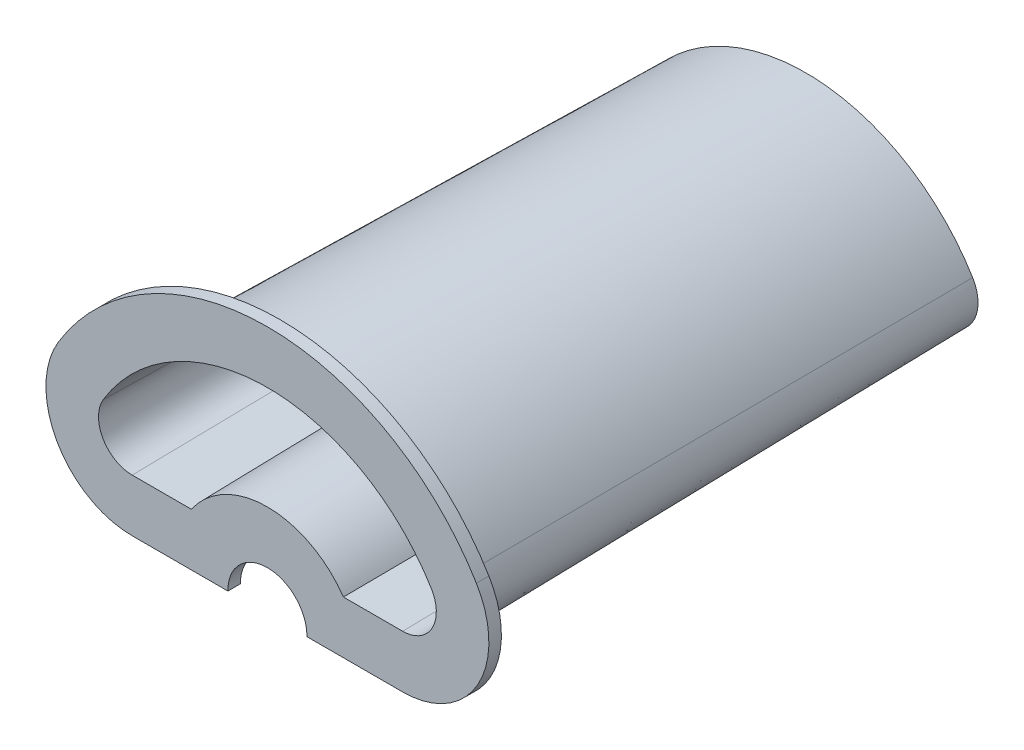
ISO-10303-21;
HEADER;
FILE_DESCRIPTION(('STEP AP214'),'2;1');
FILE_NAME('part.step','',(''),(''),'','','');
FILE_SCHEMA(('AUTOMOTIVE_DESIGN { 1 0 10303 214 1 1 1 1 }'));
ENDSEC;
DATA;
#1=APPLICATION_CONTEXT('core data for automotive mechanical design processes');
#2=APPLICATION_PROTOCOL_DEFINITION('international standard','automotive_design',2000,#1);
#3=PRODUCT_CONTEXT('',#1,'mechanical');
#4=PRODUCT('Part','Part','',(#3));
#5=PRODUCT_RELATED_PRODUCT_CATEGORY('part','',(#4));
#6=PRODUCT_DEFINITION_FORMATION('','',#4);
#7=PRODUCT_DEFINITION_CONTEXT('part definition',#1,'design');
#8=PRODUCT_DEFINITION('design','',#6,#7);
#9=PRODUCT_DEFINITION_SHAPE('','',#8);
#10=(LENGTH_UNIT() NAMED_UNIT(*) SI_UNIT(.MILLI.,.METRE.));
#11=(NAMED_UNIT(*) PLANE_ANGLE_UNIT() SI_UNIT($,.RADIAN.));
#12=(NAMED_UNIT(*) SI_UNIT($,.STERADIAN.) SOLID_ANGLE_UNIT());
#13=UNCERTAINTY_MEASURE_WITH_UNIT(LENGTH_MEASURE(1.E-05),#10,'distance_accuracy_value','');
#14=(GEOMETRIC_REPRESENTATION_CONTEXT(3) GLOBAL_UNCERTAINTY_ASSIGNED_CONTEXT((#13)) GLOBAL_UNIT_ASSIGNED_CONTEXT((#10,
#11,#12)) REPRESENTATION_CONTEXT('',''));
#15=CARTESIAN_POINT('',(0.,0.,0.));
#16=DIRECTION('',(0.,0.,1.));
#17=DIRECTION('',(1.,0.,0.));
#18=AXIS2_PLACEMENT_3D('',#15,#16,#17);
#19=CARTESIAN_POINT('',(0.,2.50379690669413,0.));
#20=DIRECTION('',(0.,0.,-1.));
#21=DIRECTION('',(1.,0.,0.));
#22=AXIS2_PLACEMENT_3D('',#19,#20,#21);
#23=CONICAL_SURFACE('',#22,15.890625,0.0174532925199433);
#24=CARTESIAN_POINT('',(0.,2.50379690669413,0.));
#25=DIRECTION('',(0.,0.,1.));
#26=DIRECTION('',(1.,0.,0.));
#27=AXIS2_PLACEMENT_3D('',#24,#25,#26);
#28=CIRCLE('',#27,15.890625);
#29=CARTESIAN_POINT('',(13.7931142241337,10.3944219066942,0.));
#30=VERTEX_POINT('',#29);
#31=CARTESIAN_POINT('',(-13.7931142241337,10.3944219066942,0.));
#32=VERTEX_POINT('',#31);
#33=EDGE_CURVE('E192',#30,#32,#28,.T.);
#34=ORIENTED_EDGE('',*,*,#33,.T.);
#35=CARTESIAN_POINT('',(-14.8180467363079,12.227203724157,-105.));
#36=CARTESIAN_POINT('',(-14.7633391999748,12.1258714248396,-99.1946764601458));
#37=CARTESIAN_POINT('',(-14.7083288659009,12.0245391753846,-93.3893557769135));
#38=CARTESIAN_POINT('',(-14.5976815182189,11.8218747826987,-81.7787204960187));
#39=CARTESIAN_POINT('',(-14.5420445046232,11.7205426394678,-75.973405898356));
#40=CARTESIAN_POINT('',(-14.3733512571635,11.4150786418874,-58.4733851973958));
#41=CARTESIAN_POINT('',(-14.2593045417743,11.2109469537689,-46.7786886174628));
#42=CARTESIAN_POINT('',(-14.0283816548114,10.8026840569934,-23.3893229259321));
#43=CARTESIAN_POINT('',(-13.9115054831249,10.5985528483364,-11.6946538143355));
#44=CARTESIAN_POINT('',(-13.7931142241338,10.3944219066942,0.));
#45=B_SPLINE_CURVE_WITH_KNOTS('',3,(#35,#36,#37,#38,#39,#40,#41,#42,#43,#44),.UNSPECIFIED.,.F.,
.F.,(4,2,2,2,4),(0.,17.4193967279432,34.8387931112639,69.9298947725837,105.02099783334),.UNSPECIFIED.);
#46=CARTESIAN_POINT('',(-14.8180467363079,12.227203724157,-105.));
#47=VERTEX_POINT('',#46);
#48=EDGE_CURVE('E191',#47,#32,#45,.T.);
#49=ORIENTED_EDGE('',*,*,#48,.F.);
#50=CARTESIAN_POINT('',(0.,2.50379690669413,-105.));
#51=DIRECTION('',(0.,0.,1.));
#52=DIRECTION('',(1.,0.,0.));
#53=AXIS2_PLACEMENT_3D('',#50,#51,#52);
#54=CIRCLE('',#53,17.7234068174629);
#55=CARTESIAN_POINT('',(14.8180467363079,12.227203724157,-105.));
#56=VERTEX_POINT('',#55);
#57=EDGE_CURVE('E179',#56,#47,#54,.T.);
#58=ORIENTED_EDGE('',*,*,#57,.F.);
#59=CARTESIAN_POINT('',(14.8180467363079,12.227203724157,-105.));
#60=CARTESIAN_POINT('',(14.7633391999748,12.1258714248396,-99.1946764601458));
#61=CARTESIAN_POINT('',(14.7083288659009,12.0245391753846,-93.3893557769135));
#62=CARTESIAN_POINT('',(14.5976815182189,11.8218747826987,-81.7787204960187));
#63=CARTESIAN_POINT('',(14.5420445046232,11.7205426394678,-75.973405898356));
#64=CARTESIAN_POINT('',(14.3733512571635,11.4150786418874,-58.4733851973958));
#65=CARTESIAN_POINT('',(14.2593045417743,11.2109469537689,-46.7786886174628));
#66=CARTESIAN_POINT('',(14.0283816548114,10.8026840569934,-23.3893229259321));
#67=CARTESIAN_POINT('',(13.9115054831249,10.5985528483364,-11.6946538143355));
#68=CARTESIAN_POINT('',(13.7931142241338,10.3944219066942,0.));
#69=B_SPLINE_CURVE_WITH_KNOTS('',3,(#59,#60,#61,#62,#63,#64,#65,#66,#67,#68),.UNSPECIFIED.,.F.,
.F.,(4,2,2,2,4),(0.,17.4193967279432,34.8387931112639,69.9298947725837,105.02099783334),.UNSPECIFIED.);
#70=EDGE_CURVE('E212',#56,#30,#69,.T.);
#71=ORIENTED_EDGE('',*,*,#70,.T.);
#72=EDGE_LOOP('',(#34,#49,#58,#71));
#73=FACE_BOUND('',#72,.T.);
#74=ADVANCED_FACE('F37',(#73),#23,.F.);
#75=CARTESIAN_POINT('',(-27.,10.3944219066942,0.));
#76=DIRECTION('',(0.,-0.999847695156391,-0.0174524064372835));
#77=DIRECTION('',(0.,0.0174524064372835,-0.999847695156391));
#78=AXIS2_PLACEMENT_3D('',#75,#76,#77);
#79=PLANE('',#78);
#80=DIRECTION('',(1.,0.,0.));
#81=VECTOR('',#80,1.);
#82=CARTESIAN_POINT('',(-27.,10.3944219066942,0.));
#83=LINE('',#82,#81);
#84=CARTESIAN_POINT('',(-27.,10.3944219066942,0.));
#85=VERTEX_POINT('',#84);
#86=EDGE_CURVE('E336',#85,#32,#83,.T.);
#87=ORIENTED_EDGE('',*,*,#86,.F.);
#88=DIRECTION('',(0.,-0.0174524064372835,0.999847695156391));
#89=VECTOR('',#88,1.);
#90=CARTESIAN_POINT('',(-27.,10.3944219066942,0.));
#91=LINE('',#90,#89);
#92=CARTESIAN_POINT('',(-27.,12.227203724157,-105.));
#93=VERTEX_POINT('',#92);
#94=EDGE_CURVE('E196',#93,#85,#91,.T.);
#95=ORIENTED_EDGE('',*,*,#94,.F.);
#96=DIRECTION('',(1.,0.,0.));
#97=VECTOR('',#96,1.);
#98=CARTESIAN_POINT('',(0.,12.227203724157,-105.));
#99=LINE('',#98,#97);
#100=EDGE_CURVE('E183',#93,#47,#99,.T.);
#101=ORIENTED_EDGE('',*,*,#100,.T.);
#102=ORIENTED_EDGE('',*,*,#48,.T.);
#103=EDGE_LOOP('',(#87,#95,#101,#102));
#104=FACE_BOUND('',#103,.T.);
#105=ADVANCED_FACE('F198',(#104),#79,.T.);
#106=CARTESIAN_POINT('',(-27.,19.6194219066942,0.));
#107=DIRECTION('',(0.,0.,1.));
#108=DIRECTION('',(1.,0.,0.));
#109=AXIS2_PLACEMENT_3D('',#106,#107,#108);
#110=CONICAL_SURFACE('',#109,9.22499999999998,0.0174532925199433);
#111=CARTESIAN_POINT('',(-27.,19.6194219066942,0.));
#112=DIRECTION('',(0.,0.,1.));
#113=DIRECTION('',(1.,0.,0.));
#114=AXIS2_PLACEMENT_3D('',#111,#112,#113);
#115=CIRCLE('',#114,9.22499999999998);
#116=CARTESIAN_POINT('',(-34.8870463730677,24.4043069114856,0.));
#117=VERTEX_POINT('',#116);
#118=EDGE_CURVE('E333',#117,#85,#115,.T.);
#119=ORIENTED_EDGE('',*,*,#118,.F.);
#120=DIRECTION('',(-0.014921185787803,0.00905233147526114,0.999847695156391));
#121=VECTOR('',#120,1.);
#122=CARTESIAN_POINT('',(-34.8870463730677,24.4043069114856,0.));
#123=LINE('',#122,#121);
#124=CARTESIAN_POINT('',(-33.3200832092688,23.4536673195688,-105.));
#125=VERTEX_POINT('',#124);
#126=EDGE_CURVE('E329',#125,#117,#123,.T.);
#127=ORIENTED_EDGE('',*,*,#126,.F.);
#128=CARTESIAN_POINT('',(-27.,19.6194219066942,-105.));
#129=DIRECTION('',(0.,0.,1.));
#130=DIRECTION('',(1.,0.,0.));
#131=AXIS2_PLACEMENT_3D('',#128,#129,#130);
#132=CIRCLE('',#131,7.39221818253713);
#133=EDGE_CURVE('E200',#125,#93,#132,.T.);
#134=ORIENTED_EDGE('',*,*,#133,.T.);
#135=ORIENTED_EDGE('',*,*,#94,.T.);
#136=EDGE_LOOP('',(#119,#127,#134,#135));
#137=FACE_BOUND('',#136,.T.);
#138=ADVANCED_FACE('F39',(#137),#110,.T.);
#139=CARTESIAN_POINT('',(0.,3.23915874879948,0.));
#140=DIRECTION('',(0.,0.,1.));
#141=DIRECTION('',(1.,0.,0.));
#142=AXIS2_PLACEMENT_3D('',#139,#140,#141);
#143=CONICAL_SURFACE('',#142,40.8052631578947,0.0174532925199433);
#144=CARTESIAN_POINT('',(0.,3.23915874879948,0.));
#145=DIRECTION('',(0.,0.,1.));
#146=DIRECTION('',(1.,0.,0.));
#147=AXIS2_PLACEMENT_3D('',#144,#145,#146);
#148=CIRCLE('',#147,40.8052631578947);
#149=CARTESIAN_POINT('',(34.8870463730677,24.4043069114856,0.));
#150=VERTEX_POINT('',#149);
#151=EDGE_CURVE('E325',#150,#117,#148,.T.);
#152=ORIENTED_EDGE('',*,*,#151,.F.);
#153=DIRECTION('',(0.0149211857878029,0.00905233147526117,0.999847695156391));
#154=VECTOR('',#153,1.);
#155=CARTESIAN_POINT('',(34.8870463730677,24.4043069114856,0.));
#156=LINE('',#155,#154);
#157=CARTESIAN_POINT('',(33.3200832092688,23.4536673195688,-105.));
#158=VERTEX_POINT('',#157);
#159=EDGE_CURVE('E327',#158,#150,#156,.T.);
#160=ORIENTED_EDGE('',*,*,#159,.F.);
#161=CARTESIAN_POINT('',(0.,3.23915874879948,-105.));
#162=DIRECTION('',(0.,0.,1.));
#163=DIRECTION('',(1.,0.,0.));
#164=AXIS2_PLACEMENT_3D('',#161,#162,#163);
#165=CIRCLE('',#164,38.9724813404318);
#166=EDGE_CURVE('E202',#158,#125,#165,.T.);
#167=ORIENTED_EDGE('',*,*,#166,.T.);
#168=ORIENTED_EDGE('',*,*,#126,.T.);
#169=EDGE_LOOP('',(#152,#160,#167,#168));
#170=FACE_BOUND('',#169,.T.);
#171=ADVANCED_FACE('F315',(#170),#143,.T.);
#172=CARTESIAN_POINT('',(27.,19.6194219066942,0.));
#173=DIRECTION('',(0.,0.,1.));
#174=DIRECTION('',(1.,0.,0.));
#175=AXIS2_PLACEMENT_3D('',#172,#173,#174);
#176=CONICAL_SURFACE('',#175,9.22499999999993,0.0174532925199433);
#177=CARTESIAN_POINT('',(27.,19.6194219066942,0.));
#178=DIRECTION('',(0.,0.,1.));
#179=DIRECTION('',(1.,0.,0.));
#180=AXIS2_PLACEMENT_3D('',#177,#178,#179);
#181=CIRCLE('',#180,9.22499999999993);
#182=CARTESIAN_POINT('',(27.,10.3944219066942,0.));
#183=VERTEX_POINT('',#182);
#184=EDGE_CURVE('E332',#183,#150,#181,.T.);
#185=ORIENTED_EDGE('',*,*,#184,.F.);
#186=DIRECTION('',(0.,-0.0174524064372835,0.999847695156391));
#187=VECTOR('',#186,1.);
#188=CARTESIAN_POINT('',(27.,10.3944219066942,0.));
#189=LINE('',#188,#187);
#190=CARTESIAN_POINT('',(27.,12.2272037241571,-105.));
#191=VERTEX_POINT('',#190);
#192=EDGE_CURVE('E307',#191,#183,#189,.T.);
#193=ORIENTED_EDGE('',*,*,#192,.F.);
#194=CARTESIAN_POINT('',(27.,19.6194219066942,-105.));
#195=DIRECTION('',(0.,0.,1.));
#196=DIRECTION('',(1.,0.,0.));
#197=AXIS2_PLACEMENT_3D('',#194,#195,#196);
#198=CIRCLE('',#197,7.39221818253708);
#199=EDGE_CURVE('E208',#191,#158,#198,.T.);
#200=ORIENTED_EDGE('',*,*,#199,.T.);
#201=ORIENTED_EDGE('',*,*,#159,.T.);
#202=EDGE_LOOP('',(#185,#193,#200,#201));
#203=FACE_BOUND('',#202,.T.);
#204=ADVANCED_FACE('F312',(#203),#176,.T.);
#205=CARTESIAN_POINT('',(27.,10.3944219066942,0.));
#206=DIRECTION('',(0.,-0.999847695156391,-0.0174524064372835));
#207=DIRECTION('',(0.,0.0174524064372835,-0.999847695156391));
#208=AXIS2_PLACEMENT_3D('',#205,#206,#207);
#209=PLANE('',#208);
#210=DIRECTION('',(-1.,0.,0.));
#211=VECTOR('',#210,1.);
#212=CARTESIAN_POINT('',(27.,10.3944219066942,0.));
#213=LINE('',#212,#211);
#214=EDGE_CURVE('E187',#183,#30,#213,.T.);
#215=ORIENTED_EDGE('',*,*,#214,.T.);
#216=ORIENTED_EDGE('',*,*,#70,.F.);
#217=DIRECTION('',(1.,0.,0.));
#218=VECTOR('',#217,1.);
#219=CARTESIAN_POINT('',(0.,12.227203724157,-105.));
#220=LINE('',#219,#218);
#221=EDGE_CURVE('E60',#191,#56,#220,.F.);
#222=ORIENTED_EDGE('',*,*,#221,.F.);
#223=ORIENTED_EDGE('',*,*,#192,.T.);
#224=EDGE_LOOP('',(#215,#216,#222,#223));
#225=FACE_BOUND('',#224,.T.);
#226=ADVANCED_FACE('F175',(#225),#209,.T.);
#227=CARTESIAN_POINT('',(0.,2.50379690669413,-105.));
#228=DIRECTION('',(0.,0.,1.));
#229=DIRECTION('',(1.,0.,0.));
#230=AXIS2_PLACEMENT_3D('',#227,#228,#229);
#231=PLANE('',#230);
#232=CARTESIAN_POINT('',(29.7171397821141,16.8730289458034,-105.));
#233=DIRECTION('',(0.,0.,1.));
#234=DIRECTION('',(1.,0.,0.));
#235=AXIS2_PLACEMENT_3D('',#232,#233,#234);
#236=CIRCLE('',#235,1.4);
#237=CARTESIAN_POINT('',(31.1171397821141,16.8730289458034,-105.));
#238=VERTEX_POINT('',#237);
#239=EDGE_CURVE('E12',#238,#238,#236,.F.);
#240=ORIENTED_EDGE('',*,*,#239,.F.);
#241=EDGE_LOOP('',(#240));
#242=FACE_BOUND('',#241,.T.);
#243=ORIENTED_EDGE('',*,*,#57,.T.);
#244=ORIENTED_EDGE('',*,*,#100,.F.);
#245=ORIENTED_EDGE('',*,*,#133,.F.);
#246=ORIENTED_EDGE('',*,*,#166,.F.);
#247=ORIENTED_EDGE('',*,*,#199,.F.);
#248=ORIENTED_EDGE('',*,*,#221,.T.);
#249=EDGE_LOOP('',(#243,#244,#245,#246,#247,#248));
#250=FACE_BOUND('',#249,.T.);
#251=ADVANCED_FACE('F172',(#242,#250),#231,.F.);
#252=CARTESIAN_POINT('',(0.,2.50379690669413,0.));
#253=DIRECTION('',(0.,0.,1.));
#254=DIRECTION('',(1.,0.,0.));
#255=AXIS2_PLACEMENT_3D('',#252,#253,#254);
#256=PLANE('',#255);
#257=CARTESIAN_POINT('',(0.,2.50379690669413,0.));
#258=DIRECTION('',(0.,0.,1.));
#259=DIRECTION('',(1.,0.,0.));
#260=AXIS2_PLACEMENT_3D('',#257,#258,#259);
#261=CIRCLE('',#260,7.89062500000001);
#262=CARTESIAN_POINT('',(7.88986691902976,2.39442190669415,0.));
#263=VERTEX_POINT('',#262);
#264=CARTESIAN_POINT('',(-7.88986691902976,2.39442190669416,0.));
#265=VERTEX_POINT('',#264);
#266=EDGE_CURVE('E373',#263,#265,#261,.T.);
#267=ORIENTED_EDGE('',*,*,#266,.T.);
#268=DIRECTION('',(1.,0.,0.));
#269=VECTOR('',#268,1.);
#270=CARTESIAN_POINT('',(-27.,2.39442190669419,0.));
#271=LINE('',#270,#269);
#272=CARTESIAN_POINT('',(-27.,2.3944219066942,0.));
#273=VERTEX_POINT('',#272);
#274=EDGE_CURVE('E370',#273,#265,#271,.T.);
#275=ORIENTED_EDGE('',*,*,#274,.F.);
#276=CARTESIAN_POINT('',(-27.,19.6194219066942,0.));
#277=DIRECTION('',(0.,0.,1.));
#278=DIRECTION('',(1.,0.,0.));
#279=AXIS2_PLACEMENT_3D('',#276,#277,#278);
#280=CIRCLE('',#279,17.225);
#281=CARTESIAN_POINT('',(-41.7267613849422,28.5538006825785,0.));
#282=VERTEX_POINT('',#281);
#283=EDGE_CURVE('E368',#282,#273,#280,.T.);
#284=ORIENTED_EDGE('',*,*,#283,.F.);
#285=CARTESIAN_POINT('',(0.,3.23915874879948,0.));
#286=DIRECTION('',(0.,0.,1.));
#287=DIRECTION('',(1.,0.,0.));
#288=AXIS2_PLACEMENT_3D('',#285,#286,#287);
#289=CIRCLE('',#288,48.8052631578947);
#290=CARTESIAN_POINT('',(41.7267613849422,28.5538006825785,0.));
#291=VERTEX_POINT('',#290);
#292=EDGE_CURVE('E366',#291,#282,#289,.T.);
#293=ORIENTED_EDGE('',*,*,#292,.F.);
#294=CARTESIAN_POINT('',(27.,19.6194219066942,0.));
#295=DIRECTION('',(0.,0.,1.));
#296=DIRECTION('',(1.,0.,0.));
#297=AXIS2_PLACEMENT_3D('',#294,#295,#296);
#298=CIRCLE('',#297,17.2249999999999);
#299=CARTESIAN_POINT('',(27.,2.39442190669421,0.));
#300=VERTEX_POINT('',#299);
#301=EDGE_CURVE('E364',#300,#291,#298,.T.);
#302=ORIENTED_EDGE('',*,*,#301,.F.);
#303=DIRECTION('',(1.,0.,0.));
#304=VECTOR('',#303,1.);
#305=CARTESIAN_POINT('',(7.88986691902976,2.39442190669415,0.));
#306=LINE('',#305,#304);
#307=EDGE_CURVE('E361',#263,#300,#306,.T.);
#308=ORIENTED_EDGE('',*,*,#307,.F.);
#309=EDGE_LOOP('',(#267,#275,#284,#293,#302,#308));
#310=FACE_BOUND('',#309,.T.);
#311=ORIENTED_EDGE('',*,*,#86,.T.);
#312=ORIENTED_EDGE('',*,*,#33,.F.);
#313=ORIENTED_EDGE('',*,*,#214,.F.);
#314=ORIENTED_EDGE('',*,*,#184,.T.);
#315=ORIENTED_EDGE('',*,*,#151,.T.);
#316=ORIENTED_EDGE('',*,*,#118,.T.);
#317=EDGE_LOOP('',(#311,#312,#313,#314,#315,#316));
#318=FACE_BOUND('',#317,.T.);
#319=ADVANCED_FACE('F174',(#310,#318),#256,.F.);
#320=CARTESIAN_POINT('',(0.,2.50379690669413,2.5));
#321=DIRECTION('',(0.,0.,-1.));
#322=DIRECTION('',(-1.,0.,0.));
#323=AXIS2_PLACEMENT_3D('',#320,#321,#322);
#324=CYLINDRICAL_SURFACE('',#323,7.89062500000001);
#325=ORIENTED_EDGE('',*,*,#266,.F.);
#326=DIRECTION('',(0.,0.,-1.));
#327=VECTOR('',#326,1.);
#328=CARTESIAN_POINT('',(7.88986691902976,2.39442190669415,2.5));
#329=LINE('',#328,#327);
#330=CARTESIAN_POINT('',(7.88986691902976,2.39442190669415,2.5));
#331=VERTEX_POINT('',#330);
#332=EDGE_CURVE('E342',#331,#263,#329,.T.);
#333=ORIENTED_EDGE('',*,*,#332,.F.);
#334=CARTESIAN_POINT('',(0.,2.50379690669413,2.5));
#335=DIRECTION('',(0.,0.,1.));
#336=DIRECTION('',(1.,0.,0.));
#337=AXIS2_PLACEMENT_3D('',#334,#335,#336);
#338=CIRCLE('',#337,7.89062500000001);
#339=CARTESIAN_POINT('',(-7.88986691902976,2.39442190669416,2.5));
#340=VERTEX_POINT('',#339);
#341=EDGE_CURVE('E363',#331,#340,#338,.T.);
#342=ORIENTED_EDGE('',*,*,#341,.T.);
#343=DIRECTION('',(0.,0.,-1.));
#344=VECTOR('',#343,1.);
#345=CARTESIAN_POINT('',(-7.88986691902976,2.39442190669416,2.5));
#346=LINE('',#345,#344);
#347=EDGE_CURVE('E347',#340,#265,#346,.T.);
#348=ORIENTED_EDGE('',*,*,#347,.T.);
#349=EDGE_LOOP('',(#325,#333,#342,#348));
#350=FACE_BOUND('',#349,.T.);
#351=ADVANCED_FACE('F423',(#350),#324,.F.);
#352=CARTESIAN_POINT('',(7.88986691902976,2.39442190669415,2.5));
#353=DIRECTION('',(0.,1.,0.));
#354=DIRECTION('',(-1.,0.,0.));
#355=AXIS2_PLACEMENT_3D('',#352,#353,#354);
#356=PLANE('',#355);
#357=ORIENTED_EDGE('',*,*,#307,.T.);
#358=DIRECTION('',(0.,0.,-1.));
#359=VECTOR('',#358,1.);
#360=CARTESIAN_POINT('',(27.,2.39442190669421,2.5));
#361=LINE('',#360,#359);
#362=CARTESIAN_POINT('',(27.,2.39442190669421,2.5));
#363=VERTEX_POINT('',#362);
#364=EDGE_CURVE('E344',#363,#300,#361,.T.);
#365=ORIENTED_EDGE('',*,*,#364,.F.);
#366=DIRECTION('',(1.,0.,0.));
#367=VECTOR('',#366,1.);
#368=CARTESIAN_POINT('',(7.88986691902976,2.39442190669415,2.5));
#369=LINE('',#368,#367);
#370=EDGE_CURVE('E350',#331,#363,#369,.T.);
#371=ORIENTED_EDGE('',*,*,#370,.F.);
#372=ORIENTED_EDGE('',*,*,#332,.T.);
#373=EDGE_LOOP('',(#357,#365,#371,#372));
#374=FACE_BOUND('',#373,.T.);
#375=ADVANCED_FACE('F425',(#374),#356,.F.);
#376=CARTESIAN_POINT('',(27.,19.6194219066942,2.5));
#377=DIRECTION('',(0.,0.,-1.));
#378=DIRECTION('',(-1.,0.,0.));
#379=AXIS2_PLACEMENT_3D('',#376,#377,#378);
#380=CYLINDRICAL_SURFACE('',#379,17.2249999999999);
#381=ORIENTED_EDGE('',*,*,#301,.T.);
#382=DIRECTION('',(0.,0.,-1.));
#383=VECTOR('',#382,1.);
#384=CARTESIAN_POINT('',(41.7267613849422,28.5538006825785,2.5));
#385=LINE('',#384,#383);
#386=CARTESIAN_POINT('',(41.7267613849422,28.5538006825785,2.5));
#387=VERTEX_POINT('',#386);
#388=EDGE_CURVE('E356',#387,#291,#385,.T.);
#389=ORIENTED_EDGE('',*,*,#388,.F.);
#390=CARTESIAN_POINT('',(27.,19.6194219066942,2.5));
#391=DIRECTION('',(0.,0.,1.));
#392=DIRECTION('',(1.,0.,0.));
#393=AXIS2_PLACEMENT_3D('',#390,#391,#392);
#394=CIRCLE('',#393,17.2249999999999);
#395=EDGE_CURVE('E378',#363,#387,#394,.T.);
#396=ORIENTED_EDGE('',*,*,#395,.F.);
#397=ORIENTED_EDGE('',*,*,#364,.T.);
#398=EDGE_LOOP('',(#381,#389,#396,#397));
#399=FACE_BOUND('',#398,.T.);
#400=ADVANCED_FACE('F428',(#399),#380,.T.);
#401=CARTESIAN_POINT('',(0.,3.23915874879948,2.5));
#402=DIRECTION('',(0.,0.,-1.));
#403=DIRECTION('',(-1.,0.,0.));
#404=AXIS2_PLACEMENT_3D('',#401,#402,#403);
#405=CYLINDRICAL_SURFACE('',#404,48.8052631578947);
#406=ORIENTED_EDGE('',*,*,#292,.T.);
#407=DIRECTION('',(0.,0.,-1.));
#408=VECTOR('',#407,1.);
#409=CARTESIAN_POINT('',(-41.7267613849422,28.5538006825785,2.5));
#410=LINE('',#409,#408);
#411=CARTESIAN_POINT('',(-41.7267613849422,28.5538006825785,2.5));
#412=VERTEX_POINT('',#411);
#413=EDGE_CURVE('E353',#412,#282,#410,.T.);
#414=ORIENTED_EDGE('',*,*,#413,.F.);
#415=CARTESIAN_POINT('',(0.,3.23915874879948,2.5));
#416=DIRECTION('',(0.,0.,1.));
#417=DIRECTION('',(1.,0.,0.));
#418=AXIS2_PLACEMENT_3D('',#415,#416,#417);
#419=CIRCLE('',#418,48.8052631578947);
#420=EDGE_CURVE('E380',#387,#412,#419,.T.);
#421=ORIENTED_EDGE('',*,*,#420,.F.);
#422=ORIENTED_EDGE('',*,*,#388,.T.);
#423=EDGE_LOOP('',(#406,#414,#421,#422));
#424=FACE_BOUND('',#423,.T.);
#425=ADVANCED_FACE('F432',(#424),#405,.T.);
#426=CARTESIAN_POINT('',(-27.,19.6194219066942,2.5));
#427=DIRECTION('',(0.,0.,-1.));
#428=DIRECTION('',(-1.,0.,0.));
#429=AXIS2_PLACEMENT_3D('',#426,#427,#428);
#430=CYLINDRICAL_SURFACE('',#429,17.225);
#431=ORIENTED_EDGE('',*,*,#283,.T.);
#432=DIRECTION('',(0.,0.,-1.));
#433=VECTOR('',#432,1.);
#434=CARTESIAN_POINT('',(-27.,2.3944219066942,2.5));
#435=LINE('',#434,#433);
#436=CARTESIAN_POINT('',(-27.,2.3944219066942,2.5));
#437=VERTEX_POINT('',#436);
#438=EDGE_CURVE('E349',#437,#273,#435,.T.);
#439=ORIENTED_EDGE('',*,*,#438,.F.);
#440=CARTESIAN_POINT('',(-27.,19.6194219066942,2.5));
#441=DIRECTION('',(0.,0.,1.));
#442=DIRECTION('',(1.,0.,0.));
#443=AXIS2_PLACEMENT_3D('',#440,#441,#442);
#444=CIRCLE('',#443,17.225);
#445=EDGE_CURVE('E382',#412,#437,#444,.T.);
#446=ORIENTED_EDGE('',*,*,#445,.F.);
#447=ORIENTED_EDGE('',*,*,#413,.T.);
#448=EDGE_LOOP('',(#431,#439,#446,#447));
#449=FACE_BOUND('',#448,.T.);
#450=ADVANCED_FACE('F436',(#449),#430,.T.);
#451=CARTESIAN_POINT('',(-27.,2.39442190669419,2.5));
#452=DIRECTION('',(0.,1.,0.));
#453=DIRECTION('',(-1.,0.,0.));
#454=AXIS2_PLACEMENT_3D('',#451,#452,#453);
#455=PLANE('',#454);
#456=ORIENTED_EDGE('',*,*,#274,.T.);
#457=ORIENTED_EDGE('',*,*,#347,.F.);
#458=DIRECTION('',(1.,0.,0.));
#459=VECTOR('',#458,1.);
#460=CARTESIAN_POINT('',(-27.,2.39442190669419,2.5));
#461=LINE('',#460,#459);
#462=EDGE_CURVE('E384',#437,#340,#461,.T.);
#463=ORIENTED_EDGE('',*,*,#462,.F.);
#464=ORIENTED_EDGE('',*,*,#438,.T.);
#465=EDGE_LOOP('',(#456,#457,#463,#464));
#466=FACE_BOUND('',#465,.T.);
#467=ADVANCED_FACE('F420',(#466),#455,.F.);
#468=CARTESIAN_POINT('',(0.,2.50379690669413,2.5));
#469=DIRECTION('',(0.,0.,1.));
#470=DIRECTION('',(1.,0.,0.));
#471=AXIS2_PLACEMENT_3D('',#468,#469,#470);
#472=PLANE('',#471);
#473=CARTESIAN_POINT('',(0.,2.50379690669413,2.5));
#474=DIRECTION('',(0.,0.,1.));
#475=DIRECTION('',(1.,0.,0.));
#476=AXIS2_PLACEMENT_3D('',#473,#474,#475);
#477=CIRCLE('',#476,18.390625);
#478=CARTESIAN_POINT('',(-15.1739909054935,12.8944219066942,2.5));
#479=VERTEX_POINT('',#478);
#480=CARTESIAN_POINT('',(15.1739909054935,12.8944219066942,2.5));
#481=VERTEX_POINT('',#480);
#482=EDGE_CURVE('E45',#479,#481,#477,.F.);
#483=ORIENTED_EDGE('',*,*,#482,.F.);
#484=DIRECTION('',(-1.,0.,0.));
#485=VECTOR('',#484,1.);
#486=CARTESIAN_POINT('',(0.,12.8944219066941,2.5));
#487=LINE('',#486,#485);
#488=CARTESIAN_POINT('',(-27.,12.8944219066942,2.5));
#489=VERTEX_POINT('',#488);
#490=EDGE_CURVE('E226',#479,#489,#487,.T.);
#491=ORIENTED_EDGE('',*,*,#490,.T.);
#492=CARTESIAN_POINT('',(-27.,19.6194219066942,2.5));
#493=DIRECTION('',(0.,0.,1.));
#494=DIRECTION('',(1.,0.,0.));
#495=AXIS2_PLACEMENT_3D('',#492,#493,#494);
#496=CIRCLE('',#495,6.72499999999996);
#497=CARTESIAN_POINT('',(-32.749635431857,23.1075901080191,2.5));
#498=VERTEX_POINT('',#497);
#499=EDGE_CURVE('E52',#489,#498,#496,.F.);
#500=ORIENTED_EDGE('',*,*,#499,.T.);
#501=CARTESIAN_POINT('',(0.,3.23915874879948,2.5));
#502=DIRECTION('',(0.,0.,1.));
#503=DIRECTION('',(1.,0.,0.));
#504=AXIS2_PLACEMENT_3D('',#501,#502,#503);
#505=CIRCLE('',#504,38.3052631578947);
#506=CARTESIAN_POINT('',(32.749635431857,23.1075901080191,2.5));
#507=VERTEX_POINT('',#506);
#508=EDGE_CURVE('E220',#498,#507,#505,.F.);
#509=ORIENTED_EDGE('',*,*,#508,.T.);
#510=CARTESIAN_POINT('',(27.,19.6194219066942,2.5));
#511=DIRECTION('',(0.,0.,1.));
#512=DIRECTION('',(1.,0.,0.));
#513=AXIS2_PLACEMENT_3D('',#510,#511,#512);
#514=CIRCLE('',#513,6.72499999999993);
#515=CARTESIAN_POINT('',(27.,12.8944219066942,2.5));
#516=VERTEX_POINT('',#515);
#517=EDGE_CURVE('E216',#507,#516,#514,.F.);
#518=ORIENTED_EDGE('',*,*,#517,.T.);
#519=DIRECTION('',(-1.,0.,0.));
#520=VECTOR('',#519,1.);
#521=CARTESIAN_POINT('',(0.,12.8944219066941,2.5));
#522=LINE('',#521,#520);
#523=EDGE_CURVE('E195',#516,#481,#522,.T.);
#524=ORIENTED_EDGE('',*,*,#523,.T.);
#525=EDGE_LOOP('',(#483,#491,#500,#509,#518,#524));
#526=FACE_BOUND('',#525,.T.);
#527=ORIENTED_EDGE('',*,*,#341,.F.);
#528=ORIENTED_EDGE('',*,*,#370,.T.);
#529=ORIENTED_EDGE('',*,*,#395,.T.);
#530=ORIENTED_EDGE('',*,*,#420,.T.);
#531=ORIENTED_EDGE('',*,*,#445,.T.);
#532=ORIENTED_EDGE('',*,*,#462,.T.);
#533=EDGE_LOOP('',(#527,#528,#529,#530,#531,#532));
#534=FACE_BOUND('',#533,.T.);
#535=ADVANCED_FACE('F243',(#526,#534),#472,.T.);
#536=CARTESIAN_POINT('',(-27.,19.6194219066942,2.5));
#537=DIRECTION('',(0.,0.,1.));
#538=DIRECTION('',(1.,0.,0.));
#539=AXIS2_PLACEMENT_3D('',#536,#537,#538);
#540=CONICAL_SURFACE('',#539,6.72499999999996,0.0174532925199433);
#541=CARTESIAN_POINT('',(-27.,19.6194219066942,-102.5));
#542=DIRECTION('',(0.,0.,1.));
#543=DIRECTION('',(1.,0.,0.));
#544=AXIS2_PLACEMENT_3D('',#541,#542,#543);
#545=CIRCLE('',#544,4.89221818253711);
#546=CARTESIAN_POINT('',(-27.,14.7272037241571,-102.5));
#547=VERTEX_POINT('',#546);
#548=CARTESIAN_POINT('',(-31.182672268058,22.1569505161023,-102.5));
#549=VERTEX_POINT('',#548);
#550=EDGE_CURVE('E388',#547,#549,#545,.F.);
#551=ORIENTED_EDGE('',*,*,#550,.T.);
#552=DIRECTION('',(-0.014921185787803,0.00905233147526113,0.999847695156391));
#553=VECTOR('',#552,1.);
#554=CARTESIAN_POINT('',(-32.749635431857,23.1075901080191,2.5));
#555=LINE('',#554,#553);
#556=EDGE_CURVE('E389',#549,#498,#555,.T.);
#557=ORIENTED_EDGE('',*,*,#556,.T.);
#558=ORIENTED_EDGE('',*,*,#499,.F.);
#559=DIRECTION('',(0.,-0.0174524064372836,0.999847695156391));
#560=VECTOR('',#559,1.);
#561=CARTESIAN_POINT('',(-27.,12.8944219066942,2.5));
#562=LINE('',#561,#560);
#563=EDGE_CURVE('E256',#547,#489,#562,.T.);
#564=ORIENTED_EDGE('',*,*,#563,.F.);
#565=EDGE_LOOP('',(#551,#557,#558,#564));
#566=FACE_BOUND('',#565,.T.);
#567=ADVANCED_FACE('F415',(#566),#540,.F.);
#568=CARTESIAN_POINT('',(0.,3.23915874879948,2.5));
#569=DIRECTION('',(0.,0.,1.));
#570=DIRECTION('',(1.,0.,0.));
#571=AXIS2_PLACEMENT_3D('',#568,#569,#570);
#572=CONICAL_SURFACE('',#571,38.3052631578947,0.0174532925199433);
#573=CARTESIAN_POINT('',(0.,3.23915874879948,-102.5));
#574=DIRECTION('',(0.,0.,1.));
#575=DIRECTION('',(1.,0.,0.));
#576=AXIS2_PLACEMENT_3D('',#573,#574,#575);
#577=CIRCLE('',#576,36.4724813404318);
#578=CARTESIAN_POINT('',(31.1826722680581,22.1569505161023,-102.5));
#579=VERTEX_POINT('',#578);
#580=EDGE_CURVE('E403',#549,#579,#577,.F.);
#581=ORIENTED_EDGE('',*,*,#580,.T.);
#582=DIRECTION('',(0.0149211857878029,0.00905233147526117,0.999847695156391));
#583=VECTOR('',#582,1.);
#584=CARTESIAN_POINT('',(32.749635431857,23.1075901080191,2.5));
#585=LINE('',#584,#583);
#586=EDGE_CURVE('E254',#579,#507,#585,.T.);
#587=ORIENTED_EDGE('',*,*,#586,.T.);
#588=ORIENTED_EDGE('',*,*,#508,.F.);
#589=ORIENTED_EDGE('',*,*,#556,.F.);
#590=EDGE_LOOP('',(#581,#587,#588,#589));
#591=FACE_BOUND('',#590,.T.);
#592=ADVANCED_FACE('F401',(#591),#572,.F.);
#593=CARTESIAN_POINT('',(27.,19.6194219066942,2.5));
#594=DIRECTION('',(0.,0.,1.));
#595=DIRECTION('',(1.,0.,0.));
#596=AXIS2_PLACEMENT_3D('',#593,#594,#595);
#597=CONICAL_SURFACE('',#596,6.72499999999993,0.0174532925199433);
#598=CARTESIAN_POINT('',(27.,19.6194219066942,-102.5));
#599=DIRECTION('',(0.,0.,1.));
#600=DIRECTION('',(1.,0.,0.));
#601=AXIS2_PLACEMENT_3D('',#598,#599,#600);
#602=CIRCLE('',#601,4.89221818253708);
#603=CARTESIAN_POINT('',(27.,14.7272037241571,-102.5));
#604=VERTEX_POINT('',#603);
#605=EDGE_CURVE('E405',#579,#604,#602,.F.);
#606=ORIENTED_EDGE('',*,*,#605,.T.);
#607=DIRECTION('',(0.,-0.0174524064372835,0.999847695156391));
#608=VECTOR('',#607,1.);
#609=CARTESIAN_POINT('',(27.,12.8944219066942,2.5));
#610=LINE('',#609,#608);
#611=EDGE_CURVE('E249',#604,#516,#610,.T.);
#612=ORIENTED_EDGE('',*,*,#611,.T.);
#613=ORIENTED_EDGE('',*,*,#517,.F.);
#614=ORIENTED_EDGE('',*,*,#586,.F.);
#615=EDGE_LOOP('',(#606,#612,#613,#614));
#616=FACE_BOUND('',#615,.T.);
#617=ADVANCED_FACE('F408',(#616),#597,.F.);
#618=CARTESIAN_POINT('',(15.1739909054935,12.8944219066942,2.5));
#619=DIRECTION('',(0.,-0.999847695156391,-0.0174524064372835));
#620=DIRECTION('',(0.,0.0174524064372835,-0.999847695156391));
#621=AXIS2_PLACEMENT_3D('',#618,#619,#620);
#622=PLANE('',#621);
#623=DIRECTION('',(-1.,0.,0.));
#624=VECTOR('',#623,1.);
#625=CARTESIAN_POINT('',(15.1739909054935,14.727203724157,-102.5));
#626=LINE('',#625,#624);
#627=CARTESIAN_POINT('',(16.1113161808527,14.727203724157,-102.5));
#628=VERTEX_POINT('',#627);
#629=EDGE_CURVE('E251',#604,#628,#626,.T.);
#630=ORIENTED_EDGE('',*,*,#629,.T.);
#631=CARTESIAN_POINT('',(16.7552715518239,16.0499922051542,-178.282501321939));
#632=CARTESIAN_POINT('',(16.6964534494491,15.9268021973792,-171.224950503217));
#633=CARTESIAN_POINT('',(16.6373251322298,15.8036122349349,-164.167402281487));
#634=CARTESIAN_POINT('',(16.5184289160983,15.5572324066279,-150.052311371184));
#635=CARTESIAN_POINT('',(16.4586610171995,15.4340425407651,-142.99476868261));
#636=CARTESIAN_POINT('',(16.2020901225526,14.9081131067421,-112.864291586942));
#637=CARTESIAN_POINT('',(16.0020961875213,14.5053740102316,-89.791384200652));
#638=CARTESIAN_POINT('',(15.5941958520911,13.6998970110476,-43.6456378229403));
#639=CARTESIAN_POINT('',(15.386289451152,13.2971591083741,-20.5727988315231));
#640=CARTESIAN_POINT('',(15.1739909054935,12.8944219066942,2.49999999999997));
#641=B_SPLINE_CURVE_WITH_KNOTS('',3,(#631,#632,#633,#634,#635,#636,#637,#638,#639,#640),
.UNSPECIFIED.,.F.,.F.,(4,2,2,2,4),(0.,21.1766127784976,42.3532251156595,111.585089680584,
180.816958971138),.UNSPECIFIED.);
#642=EDGE_CURVE('E237',#628,#481,#641,.T.);
#643=ORIENTED_EDGE('',*,*,#642,.T.);
#644=ORIENTED_EDGE('',*,*,#523,.F.);
#645=ORIENTED_EDGE('',*,*,#611,.F.);
#646=EDGE_LOOP('',(#630,#643,#644,#645));
#647=FACE_BOUND('',#646,.T.);
#648=ADVANCED_FACE('F248',(#647),#622,.F.);
#649=CARTESIAN_POINT('',(0.,2.50379690669413,2.5));
#650=DIRECTION('',(0.,0.,-1.));
#651=DIRECTION('',(1.,0.,0.));
#652=AXIS2_PLACEMENT_3D('',#649,#650,#651);
#653=CONICAL_SURFACE('',#652,18.390625,0.0174532925199433);
#654=CARTESIAN_POINT('',(-16.7552715518239,16.0499922051542,-178.282501321939));
#655=CARTESIAN_POINT('',(-16.6964534494491,15.9268021973792,-171.224950503217));
#656=CARTESIAN_POINT('',(-16.6373251322298,15.8036122349349,-164.167402281487));
#657=CARTESIAN_POINT('',(-16.5184289160984,15.5572324066279,-150.052311371184));
#658=CARTESIAN_POINT('',(-16.4586610171995,15.4340425407651,-142.99476868261));
#659=CARTESIAN_POINT('',(-16.2020901225526,14.9081131067421,-112.864291586942));
#660=CARTESIAN_POINT('',(-16.0020961875213,14.5053740102316,-89.7913842006519));
#661=CARTESIAN_POINT('',(-15.5941958520911,13.6998970110476,-43.6456378229403));
#662=CARTESIAN_POINT('',(-15.386289451152,13.2971591083741,-20.5727988315231));
#663=CARTESIAN_POINT('',(-15.1739909054935,12.8944219066942,2.49999999999997));
#664=B_SPLINE_CURVE_WITH_KNOTS('',3,(#654,#655,#656,#657,#658,#659,#660,#661,#662,#663),
.UNSPECIFIED.,.F.,.F.,(4,2,2,2,4),(0.,21.1766127784976,42.3532251156595,111.585089680584,
180.816958971138),.UNSPECIFIED.);
#665=CARTESIAN_POINT('',(-16.1113161808527,14.727203724157,-102.5));
#666=VERTEX_POINT('',#665);
#667=EDGE_CURVE('E239',#666,#479,#664,.T.);
#668=ORIENTED_EDGE('',*,*,#667,.T.);
#669=ORIENTED_EDGE('',*,*,#482,.T.);
#670=ORIENTED_EDGE('',*,*,#642,.F.);
#671=CARTESIAN_POINT('',(0.,2.50379690669413,-102.5));
#672=DIRECTION('',(0.,0.,1.));
#673=DIRECTION('',(1.,0.,0.));
#674=AXIS2_PLACEMENT_3D('',#671,#672,#673);
#675=CIRCLE('',#674,20.2234068174629);
#676=EDGE_CURVE('E393',#666,#628,#675,.F.);
#677=ORIENTED_EDGE('',*,*,#676,.F.);
#678=EDGE_LOOP('',(#668,#669,#670,#677));
#679=FACE_BOUND('',#678,.T.);
#680=ADVANCED_FACE('F236',(#679),#653,.T.);
#681=CARTESIAN_POINT('',(-27.,12.8944219066942,2.5));
#682=DIRECTION('',(0.,-0.999847695156391,-0.0174524064372835));
#683=DIRECTION('',(0.,0.0174524064372835,-0.999847695156391));
#684=AXIS2_PLACEMENT_3D('',#681,#682,#683);
#685=PLANE('',#684);
#686=DIRECTION('',(-1.,0.,0.));
#687=VECTOR('',#686,1.);
#688=CARTESIAN_POINT('',(-27.,14.7272037241571,-102.5));
#689=LINE('',#688,#687);
#690=EDGE_CURVE('E376',#666,#547,#689,.T.);
#691=ORIENTED_EDGE('',*,*,#690,.T.);
#692=ORIENTED_EDGE('',*,*,#563,.T.);
#693=ORIENTED_EDGE('',*,*,#490,.F.);
#694=ORIENTED_EDGE('',*,*,#667,.F.);
#695=EDGE_LOOP('',(#691,#692,#693,#694));
#696=FACE_BOUND('',#695,.T.);
#697=ADVANCED_FACE('F276',(#696),#685,.F.);
#698=CARTESIAN_POINT('',(0.,2.50379690669413,-102.5));
#699=DIRECTION('',(0.,0.,1.));
#700=DIRECTION('',(1.,0.,0.));
#701=AXIS2_PLACEMENT_3D('',#698,#699,#700);
#702=PLANE('',#701);
#703=ORIENTED_EDGE('',*,*,#550,.F.);
#704=ORIENTED_EDGE('',*,*,#690,.F.);
#705=ORIENTED_EDGE('',*,*,#676,.T.);
#706=ORIENTED_EDGE('',*,*,#629,.F.);
#707=ORIENTED_EDGE('',*,*,#605,.F.);
#708=ORIENTED_EDGE('',*,*,#580,.F.);
#709=EDGE_LOOP('',(#703,#704,#705,#706,#707,#708));
#710=FACE_BOUND('',#709,.T.);
#711=ADVANCED_FACE('F168',(#710),#702,.T.);
#712=CARTESIAN_POINT('',(29.7171397821141,16.8730289458034,-105.));
#713=DIRECTION('',(0.,0.,1.));
#714=DIRECTION('',(-1.,0.,0.));
#715=AXIS2_PLACEMENT_3D('',#712,#713,#714);
#716=CONICAL_SURFACE('',#715,1.4,0.78539816339745);
#717=CARTESIAN_POINT('',(29.7171397821141,16.8730289458034,-106.4));
#718=VERTEX_POINT('',#717);
#719=VERTEX_LOOP('',#718);
#720=FACE_BOUND('',#719,.T.);
#721=ORIENTED_EDGE('',*,*,#239,.T.);
#722=EDGE_LOOP('',(#721));
#723=FACE_BOUND('',#722,.T.);
#724=ADVANCED_FACE('F165',(#720,#723),#716,.T.);
#725=CLOSED_SHELL('',(#74,#105,#138,#171,#204,#226,#251,#319,#351,#375,#400,#425,#450,#467,#535,
#567,#592,#617,#648,#680,#697,#711,#724));
#726=MANIFOLD_SOLID_BREP('B2',#725);
#727=ADVANCED_BREP_SHAPE_REPRESENTATION('',(#18,#726),#14);
#728=SHAPE_DEFINITION_REPRESENTATION(#9,#727);
ENDSEC;
END-ISO-10303-21;
